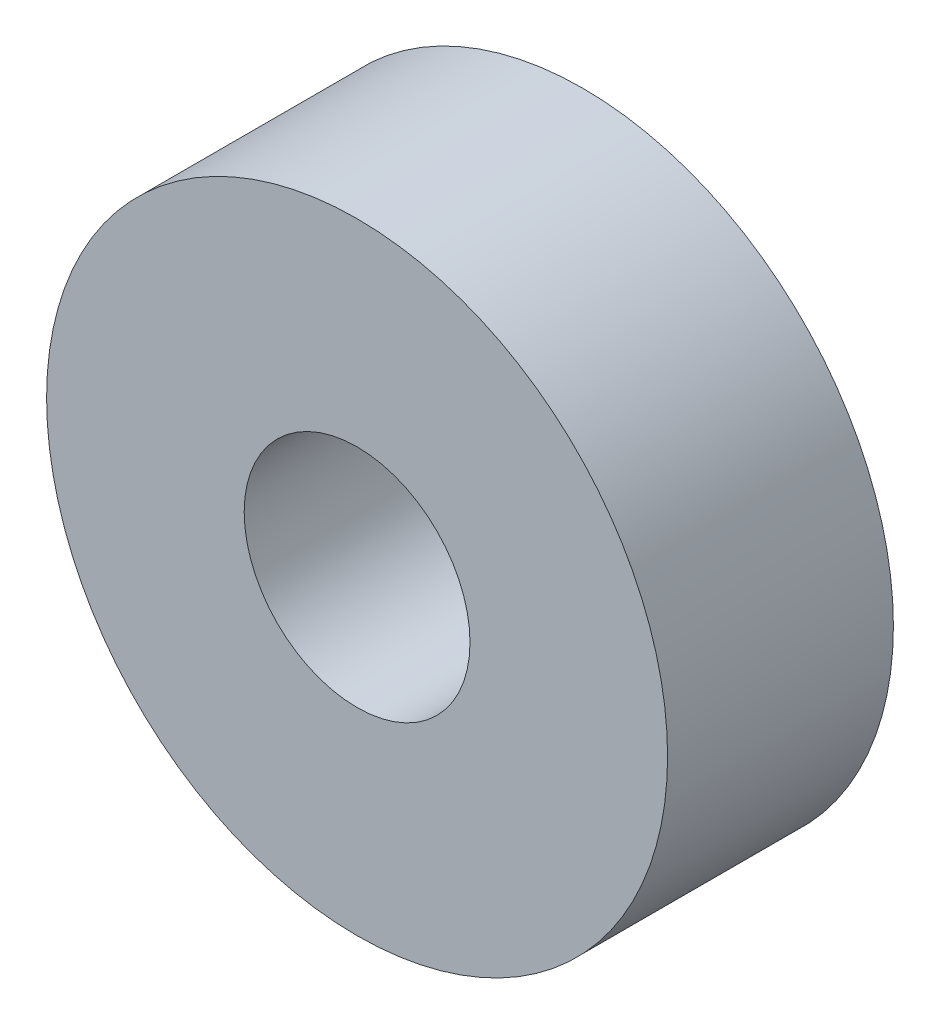
ISO-10303-21;
HEADER;
FILE_DESCRIPTION(('STEP AP214'),'2;1');
FILE_NAME('part.step','',(''),(''),'','','');
FILE_SCHEMA(('AUTOMOTIVE_DESIGN { 1 0 10303 214 1 1 1 1 }'));
ENDSEC;
DATA;
#1=APPLICATION_CONTEXT('core data for automotive mechanical design processes');
#2=APPLICATION_PROTOCOL_DEFINITION('international standard','automotive_design',2000,#1);
#3=PRODUCT_CONTEXT('',#1,'mechanical');
#4=PRODUCT('Part','Part','',(#3));
#5=PRODUCT_RELATED_PRODUCT_CATEGORY('part','',(#4));
#6=PRODUCT_DEFINITION_FORMATION('','',#4);
#7=PRODUCT_DEFINITION_CONTEXT('part definition',#1,'design');
#8=PRODUCT_DEFINITION('design','',#6,#7);
#9=PRODUCT_DEFINITION_SHAPE('','',#8);
#10=(LENGTH_UNIT() NAMED_UNIT(*) SI_UNIT(.MILLI.,.METRE.));
#11=(NAMED_UNIT(*) PLANE_ANGLE_UNIT() SI_UNIT($,.RADIAN.));
#12=(NAMED_UNIT(*) SI_UNIT($,.STERADIAN.) SOLID_ANGLE_UNIT());
#13=UNCERTAINTY_MEASURE_WITH_UNIT(LENGTH_MEASURE(1.E-05),#10,'distance_accuracy_value','');
#14=(GEOMETRIC_REPRESENTATION_CONTEXT(3) GLOBAL_UNCERTAINTY_ASSIGNED_CONTEXT((#13)) GLOBAL_UNIT_ASSIGNED_CONTEXT((#10,
#11,#12)) REPRESENTATION_CONTEXT('',''));
#15=CARTESIAN_POINT('',(0.,0.,0.));
#16=DIRECTION('',(0.,0.,1.));
#17=DIRECTION('',(1.,0.,0.));
#18=AXIS2_PLACEMENT_3D('',#15,#16,#17);
#19=CARTESIAN_POINT('',(0.,0.,8.));
#20=DIRECTION('',(0.,0.,1.));
#21=DIRECTION('',(1.,0.,0.));
#22=AXIS2_PLACEMENT_3D('',#19,#20,#21);
#23=PLANE('',#22);
#24=CARTESIAN_POINT('',(0.,0.,8.));
#25=DIRECTION('',(0.,0.,1.));
#26=DIRECTION('',(1.,0.,0.));
#27=AXIS2_PLACEMENT_3D('',#24,#25,#26);
#28=CIRCLE('',#27,11.);
#29=CARTESIAN_POINT('',(11.,0.,8.));
#30=VERTEX_POINT('',#29);
#31=EDGE_CURVE('E10',#30,#30,#28,.T.);
#32=ORIENTED_EDGE('',*,*,#31,.T.);
#33=EDGE_LOOP('',(#32));
#34=FACE_BOUND('',#33,.T.);
#35=CARTESIAN_POINT('',(0.,0.,8.));
#36=DIRECTION('',(0.,0.,1.));
#37=DIRECTION('',(1.,0.,0.));
#38=AXIS2_PLACEMENT_3D('',#35,#36,#37);
#39=CIRCLE('',#38,4.);
#40=CARTESIAN_POINT('',(4.,0.,8.));
#41=VERTEX_POINT('',#40);
#42=EDGE_CURVE('E42',#41,#41,#39,.T.);
#43=ORIENTED_EDGE('',*,*,#42,.F.);
#44=EDGE_LOOP('',(#43));
#45=FACE_BOUND('',#44,.T.);
#46=ADVANCED_FACE('F31',(#34,#45),#23,.T.);
#47=CARTESIAN_POINT('',(0.,0.,0.));
#48=DIRECTION('',(0.,0.,1.));
#49=DIRECTION('',(1.,0.,0.));
#50=AXIS2_PLACEMENT_3D('',#47,#48,#49);
#51=PLANE('',#50);
#52=CARTESIAN_POINT('',(0.,0.,0.));
#53=DIRECTION('',(0.,0.,1.));
#54=DIRECTION('',(1.,0.,0.));
#55=AXIS2_PLACEMENT_3D('',#52,#53,#54);
#56=CIRCLE('',#55,11.);
#57=CARTESIAN_POINT('',(11.,0.,0.));
#58=VERTEX_POINT('',#57);
#59=EDGE_CURVE('E35',#58,#58,#56,.T.);
#60=ORIENTED_EDGE('',*,*,#59,.F.);
#61=EDGE_LOOP('',(#60));
#62=FACE_BOUND('',#61,.T.);
#63=CARTESIAN_POINT('',(0.,0.,0.));
#64=DIRECTION('',(0.,0.,1.));
#65=DIRECTION('',(1.,0.,0.));
#66=AXIS2_PLACEMENT_3D('',#63,#64,#65);
#67=CIRCLE('',#66,4.);
#68=CARTESIAN_POINT('',(4.,0.,0.));
#69=VERTEX_POINT('',#68);
#70=EDGE_CURVE('E44',#69,#69,#67,.T.);
#71=ORIENTED_EDGE('',*,*,#70,.T.);
#72=EDGE_LOOP('',(#71));
#73=FACE_BOUND('',#72,.T.);
#74=ADVANCED_FACE('F54',(#62,#73),#51,.F.);
#75=CARTESIAN_POINT('',(0.,0.,8.));
#76=DIRECTION('',(0.,0.,-1.));
#77=DIRECTION('',(-1.,0.,0.));
#78=AXIS2_PLACEMENT_3D('',#75,#76,#77);
#79=CYLINDRICAL_SURFACE('',#78,11.);
#80=ORIENTED_EDGE('',*,*,#31,.F.);
#81=EDGE_LOOP('',(#80));
#82=FACE_BOUND('',#81,.T.);
#83=ORIENTED_EDGE('',*,*,#59,.T.);
#84=EDGE_LOOP('',(#83));
#85=FACE_BOUND('',#84,.T.);
#86=ADVANCED_FACE('F33',(#82,#85),#79,.T.);
#87=CARTESIAN_POINT('',(0.,0.,8.));
#88=DIRECTION('',(0.,0.,-1.));
#89=DIRECTION('',(-1.,0.,0.));
#90=AXIS2_PLACEMENT_3D('',#87,#88,#89);
#91=CYLINDRICAL_SURFACE('',#90,4.);
#92=ORIENTED_EDGE('',*,*,#42,.T.);
#93=EDGE_LOOP('',(#92));
#94=FACE_BOUND('',#93,.T.);
#95=ORIENTED_EDGE('',*,*,#70,.F.);
#96=EDGE_LOOP('',(#95));
#97=FACE_BOUND('',#96,.T.);
#98=ADVANCED_FACE('F50',(#94,#97),#91,.F.);
#99=CLOSED_SHELL('',(#46,#74,#86,#98));
#100=MANIFOLD_SOLID_BREP('B2',#99);
#101=ADVANCED_BREP_SHAPE_REPRESENTATION('',(#18,#100),#14);
#102=SHAPE_DEFINITION_REPRESENTATION(#9,#101);
ENDSEC;
END-ISO-10303-21;
